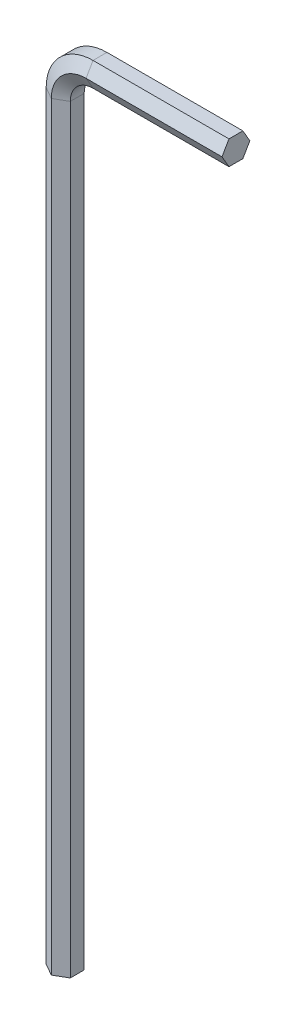
ISO-10303-21;
HEADER;
FILE_DESCRIPTION(('STEP AP214'),'2;1');
FILE_NAME('part.step','',(''),(''),'','','');
FILE_SCHEMA(('AUTOMOTIVE_DESIGN { 1 0 10303 214 1 1 1 1 }'));
ENDSEC;
DATA;
#1=APPLICATION_CONTEXT('core data for automotive mechanical design processes');
#2=APPLICATION_PROTOCOL_DEFINITION('international standard','automotive_design',2000,#1);
#3=PRODUCT_CONTEXT('',#1,'mechanical');
#4=PRODUCT('Part','Part','',(#3));
#5=PRODUCT_RELATED_PRODUCT_CATEGORY('part','',(#4));
#6=PRODUCT_DEFINITION_FORMATION('','',#4);
#7=PRODUCT_DEFINITION_CONTEXT('part definition',#1,'design');
#8=PRODUCT_DEFINITION('design','',#6,#7);
#9=PRODUCT_DEFINITION_SHAPE('','',#8);
#10=(LENGTH_UNIT() NAMED_UNIT(*) SI_UNIT(.MILLI.,.METRE.));
#11=(NAMED_UNIT(*) PLANE_ANGLE_UNIT() SI_UNIT($,.RADIAN.));
#12=(NAMED_UNIT(*) SI_UNIT($,.STERADIAN.) SOLID_ANGLE_UNIT());
#13=UNCERTAINTY_MEASURE_WITH_UNIT(LENGTH_MEASURE(1.E-05),#10,'distance_accuracy_value','');
#14=(GEOMETRIC_REPRESENTATION_CONTEXT(3) GLOBAL_UNCERTAINTY_ASSIGNED_CONTEXT((#13)) GLOBAL_UNIT_ASSIGNED_CONTEXT((#10,
#11,#12)) REPRESENTATION_CONTEXT('',''));
#15=CARTESIAN_POINT('',(0.,0.,0.));
#16=DIRECTION('',(0.,0.,1.));
#17=DIRECTION('',(1.,0.,0.));
#18=AXIS2_PLACEMENT_3D('',#15,#16,#17);
#19=CARTESIAN_POINT('',(4.00000000000003,91.2157,-1.5984519552784));
#20=DIRECTION('',(0.,0.500000000000001,-0.866025403784438));
#21=DIRECTION('',(0.,0.866025403784438,0.500000000000001));
#22=AXIS2_PLACEMENT_3D('',#19,#20,#21);
#23=PLANE('',#22);
#24=DIRECTION('',(0.,0.866025403784438,0.500000000000001));
#25=VECTOR('',#24,1.);
#26=CARTESIAN_POINT('',(4.00000000000003,91.2157,-1.5984519552784));
#27=LINE('',#26,#25);
#28=CARTESIAN_POINT('',(4.00000000000003,91.2157,-1.5984519552784));
#29=VERTEX_POINT('',#28);
#30=CARTESIAN_POINT('',(4.00000000000005,92.6,-0.799225977639195));
#31=VERTEX_POINT('',#30);
#32=EDGE_CURVE('E130',#29,#31,#27,.T.);
#33=ORIENTED_EDGE('',*,*,#32,.T.);
#34=DIRECTION('',(1.,0.,0.));
#35=VECTOR('',#34,1.);
#36=CARTESIAN_POINT('',(4.00000000000005,92.6,-0.799225977639195));
#37=LINE('',#36,#35);
#38=CARTESIAN_POINT('',(19.6157,92.6,-0.799225977639195));
#39=VERTEX_POINT('',#38);
#40=EDGE_CURVE('E39',#31,#39,#37,.T.);
#41=ORIENTED_EDGE('',*,*,#40,.T.);
#42=DIRECTION('',(0.,0.866025403784438,0.500000000000001));
#43=VECTOR('',#42,1.);
#44=CARTESIAN_POINT('',(19.6157,91.2157,-1.5984519552784));
#45=LINE('',#44,#43);
#46=CARTESIAN_POINT('',(19.6157,91.2157,-1.5984519552784));
#47=VERTEX_POINT('',#46);
#48=EDGE_CURVE('E46',#47,#39,#45,.T.);
#49=ORIENTED_EDGE('',*,*,#48,.F.);
#50=DIRECTION('',(1.,0.,0.));
#51=VECTOR('',#50,1.);
#52=CARTESIAN_POINT('',(4.00000000000003,91.2157,-1.5984519552784));
#53=LINE('',#52,#51);
#54=EDGE_CURVE('E11',#29,#47,#53,.T.);
#55=ORIENTED_EDGE('',*,*,#54,.F.);
#56=EDGE_LOOP('',(#33,#41,#49,#55));
#57=FACE_BOUND('',#56,.T.);
#58=ADVANCED_FACE('F32',(#57),#23,.T.);
#59=CARTESIAN_POINT('',(4.00000000000005,92.6,-0.799225977639195));
#60=DIRECTION('',(0.,1.,0.));
#61=DIRECTION('',(0.,0.,1.));
#62=AXIS2_PLACEMENT_3D('',#59,#60,#61);
#63=PLANE('',#62);
#64=DIRECTION('',(0.,0.,1.));
#65=VECTOR('',#64,1.);
#66=CARTESIAN_POINT('',(4.00000000000005,92.6,-0.799225977639195));
#67=LINE('',#66,#65);
#68=CARTESIAN_POINT('',(4.00000000000005,92.6,0.799225977639204));
#69=VERTEX_POINT('',#68);
#70=EDGE_CURVE('E177',#31,#69,#67,.T.);
#71=ORIENTED_EDGE('',*,*,#70,.T.);
#72=DIRECTION('',(1.,0.,0.));
#73=VECTOR('',#72,1.);
#74=CARTESIAN_POINT('',(4.00000000000005,92.6,0.799225977639204));
#75=LINE('',#74,#73);
#76=CARTESIAN_POINT('',(19.6157,92.6,0.799225977639204));
#77=VERTEX_POINT('',#76);
#78=EDGE_CURVE('E213',#69,#77,#75,.T.);
#79=ORIENTED_EDGE('',*,*,#78,.T.);
#80=DIRECTION('',(0.,0.,1.));
#81=VECTOR('',#80,1.);
#82=CARTESIAN_POINT('',(19.6157,92.6,-0.799225977639195));
#83=LINE('',#82,#81);
#84=EDGE_CURVE('E54',#39,#77,#83,.T.);
#85=ORIENTED_EDGE('',*,*,#84,.F.);
#86=ORIENTED_EDGE('',*,*,#40,.F.);
#87=EDGE_LOOP('',(#71,#79,#85,#86));
#88=FACE_BOUND('',#87,.T.);
#89=ADVANCED_FACE('F215',(#88),#63,.T.);
#90=CARTESIAN_POINT('',(4.00000000000005,92.6,0.799225977639204));
#91=DIRECTION('',(0.,0.499999999999995,0.866025403784441));
#92=DIRECTION('',(0.,-0.866025403784441,0.499999999999995));
#93=AXIS2_PLACEMENT_3D('',#90,#91,#92);
#94=PLANE('',#93);
#95=DIRECTION('',(0.,-0.866025403784441,0.499999999999995));
#96=VECTOR('',#95,1.);
#97=CARTESIAN_POINT('',(4.00000000000005,92.6,0.799225977639204));
#98=LINE('',#97,#96);
#99=CARTESIAN_POINT('',(4.00000000000003,91.2157,1.5984519552784));
#100=VERTEX_POINT('',#99);
#101=EDGE_CURVE('E174',#69,#100,#98,.T.);
#102=ORIENTED_EDGE('',*,*,#101,.T.);
#103=DIRECTION('',(1.,0.,0.));
#104=VECTOR('',#103,1.);
#105=CARTESIAN_POINT('',(4.00000000000003,91.2157,1.5984519552784));
#106=LINE('',#105,#104);
#107=CARTESIAN_POINT('',(19.6157,91.2157,1.5984519552784));
#108=VERTEX_POINT('',#107);
#109=EDGE_CURVE('E210',#100,#108,#106,.T.);
#110=ORIENTED_EDGE('',*,*,#109,.T.);
#111=DIRECTION('',(0.,-0.866025403784441,0.499999999999995));
#112=VECTOR('',#111,1.);
#113=CARTESIAN_POINT('',(19.6157,92.6,0.799225977639204));
#114=LINE('',#113,#112);
#115=EDGE_CURVE('E199',#77,#108,#114,.T.);
#116=ORIENTED_EDGE('',*,*,#115,.F.);
#117=ORIENTED_EDGE('',*,*,#78,.F.);
#118=EDGE_LOOP('',(#102,#110,#116,#117));
#119=FACE_BOUND('',#118,.T.);
#120=ADVANCED_FACE('F280',(#119),#94,.T.);
#121=CARTESIAN_POINT('',(4.00000000000003,91.2157,1.5984519552784));
#122=DIRECTION('',(0.,-0.500000000000007,0.866025403784435));
#123=DIRECTION('',(0.,-0.866025403784435,-0.500000000000007));
#124=AXIS2_PLACEMENT_3D('',#121,#122,#123);
#125=PLANE('',#124);
#126=DIRECTION('',(0.,-0.866025403784435,-0.500000000000007));
#127=VECTOR('',#126,1.);
#128=CARTESIAN_POINT('',(4.00000000000003,91.2157,1.5984519552784));
#129=LINE('',#128,#127);
#130=CARTESIAN_POINT('',(4.00000000000002,89.8314,0.799225977639185));
#131=VERTEX_POINT('',#130);
#132=EDGE_CURVE('E171',#100,#131,#129,.T.);
#133=ORIENTED_EDGE('',*,*,#132,.T.);
#134=DIRECTION('',(1.,0.,0.));
#135=VECTOR('',#134,1.);
#136=CARTESIAN_POINT('',(4.00000000000002,89.8314,0.799225977639185));
#137=LINE('',#136,#135);
#138=CARTESIAN_POINT('',(19.6157,89.8314,0.799225977639185));
#139=VERTEX_POINT('',#138);
#140=EDGE_CURVE('E207',#131,#139,#137,.T.);
#141=ORIENTED_EDGE('',*,*,#140,.T.);
#142=DIRECTION('',(0.,-0.866025403784435,-0.500000000000007));
#143=VECTOR('',#142,1.);
#144=CARTESIAN_POINT('',(19.6157,91.2157,1.5984519552784));
#145=LINE('',#144,#143);
#146=EDGE_CURVE('E196',#108,#139,#145,.T.);
#147=ORIENTED_EDGE('',*,*,#146,.F.);
#148=ORIENTED_EDGE('',*,*,#109,.F.);
#149=EDGE_LOOP('',(#133,#141,#147,#148));
#150=FACE_BOUND('',#149,.T.);
#151=ADVANCED_FACE('F279',(#150),#125,.T.);
#152=CARTESIAN_POINT('',(4.00000000000002,89.8314,0.799225977639185));
#153=DIRECTION('',(0.,-1.,0.));
#154=DIRECTION('',(0.,0.,-1.));
#155=AXIS2_PLACEMENT_3D('',#152,#153,#154);
#156=PLANE('',#155);
#157=DIRECTION('',(0.,0.,-1.));
#158=VECTOR('',#157,1.);
#159=CARTESIAN_POINT('',(4.00000000000002,89.8314,0.799225977639185));
#160=LINE('',#159,#158);
#161=CARTESIAN_POINT('',(4.00000000000002,89.8314,-0.799225977639214));
#162=VERTEX_POINT('',#161);
#163=EDGE_CURVE('E163',#131,#162,#160,.T.);
#164=ORIENTED_EDGE('',*,*,#163,.T.);
#165=DIRECTION('',(1.,0.,0.));
#166=VECTOR('',#165,1.);
#167=CARTESIAN_POINT('',(4.00000000000002,89.8314,-0.799225977639214));
#168=LINE('',#167,#166);
#169=CARTESIAN_POINT('',(19.6157,89.8314,-0.799225977639214));
#170=VERTEX_POINT('',#169);
#171=EDGE_CURVE('E204',#162,#170,#168,.T.);
#172=ORIENTED_EDGE('',*,*,#171,.T.);
#173=DIRECTION('',(0.,0.,-1.));
#174=VECTOR('',#173,1.);
#175=CARTESIAN_POINT('',(19.6157,89.8314,0.799225977639185));
#176=LINE('',#175,#174);
#177=EDGE_CURVE('E193',#139,#170,#176,.T.);
#178=ORIENTED_EDGE('',*,*,#177,.F.);
#179=ORIENTED_EDGE('',*,*,#140,.F.);
#180=EDGE_LOOP('',(#164,#172,#178,#179));
#181=FACE_BOUND('',#180,.T.);
#182=ADVANCED_FACE('F286',(#181),#156,.T.);
#183=CARTESIAN_POINT('',(4.00000000000002,89.8314,-0.799225977639214));
#184=DIRECTION('',(0.,-0.499999999999995,-0.866025403784442));
#185=DIRECTION('',(0.,0.866025403784441,-0.499999999999995));
#186=AXIS2_PLACEMENT_3D('',#183,#184,#185);
#187=PLANE('',#186);
#188=DIRECTION('',(0.,0.866025403784442,-0.499999999999995));
#189=VECTOR('',#188,1.);
#190=CARTESIAN_POINT('',(4.00000000000002,89.8314,-0.799225977639214));
#191=LINE('',#190,#189);
#192=EDGE_CURVE('E160',#162,#29,#191,.T.);
#193=ORIENTED_EDGE('',*,*,#192,.T.);
#194=ORIENTED_EDGE('',*,*,#54,.T.);
#195=DIRECTION('',(0.,0.866025403784442,-0.499999999999995));
#196=VECTOR('',#195,1.);
#197=CARTESIAN_POINT('',(19.6157,89.8314,-0.799225977639214));
#198=LINE('',#197,#196);
#199=EDGE_CURVE('E133',#170,#47,#198,.T.);
#200=ORIENTED_EDGE('',*,*,#199,.F.);
#201=ORIENTED_EDGE('',*,*,#171,.F.);
#202=EDGE_LOOP('',(#193,#194,#200,#201));
#203=FACE_BOUND('',#202,.T.);
#204=ADVANCED_FACE('F284',(#203),#187,.T.);
#205=CARTESIAN_POINT('',(4.,87.2157,-1.5984519552784));
#206=DIRECTION('',(0.,0.,1.));
#207=DIRECTION('',(1.,0.,0.));
#208=AXIS2_PLACEMENT_3D('',#205,#206,#207);
#209=CONICAL_SURFACE('',#208,4.,1.0471975511966);
#210=DIRECTION('',(-0.866025403784438,0.,0.500000000000001));
#211=VECTOR('',#210,1.);
#212=CARTESIAN_POINT('',(0.,87.2157,-1.5984519552784));
#213=LINE('',#212,#211);
#214=CARTESIAN_POINT('',(0.,87.2157,-1.5984519552784));
#215=VERTEX_POINT('',#214);
#216=CARTESIAN_POINT('',(-1.3843,87.2157,-0.799225977639195));
#217=VERTEX_POINT('',#216);
#218=EDGE_CURVE('E127',#215,#217,#213,.T.);
#219=ORIENTED_EDGE('',*,*,#218,.T.);
#220=CARTESIAN_POINT('',(4.,87.2157,-0.799225977639195));
#221=DIRECTION('',(0.,0.,-1.));
#222=DIRECTION('',(-1.,0.,0.));
#223=AXIS2_PLACEMENT_3D('',#220,#221,#222);
#224=CIRCLE('',#223,5.3843);
#225=EDGE_CURVE('E134',#217,#31,#224,.T.);
#226=ORIENTED_EDGE('',*,*,#225,.T.);
#227=ORIENTED_EDGE('',*,*,#32,.F.);
#228=CARTESIAN_POINT('',(4.,87.2157,-1.5984519552784));
#229=DIRECTION('',(0.,0.,-1.));
#230=DIRECTION('',(-1.,0.,0.));
#231=AXIS2_PLACEMENT_3D('',#228,#229,#230);
#232=CIRCLE('',#231,4.);
#233=EDGE_CURVE('E122',#215,#29,#232,.T.);
#234=ORIENTED_EDGE('',*,*,#233,.F.);
#235=EDGE_LOOP('',(#219,#226,#227,#234));
#236=FACE_BOUND('',#235,.T.);
#237=ADVANCED_FACE('F124',(#236),#209,.T.);
#238=CARTESIAN_POINT('',(4.,87.2157,0.));
#239=DIRECTION('',(0.,0.,-1.));
#240=DIRECTION('',(-1.,0.,0.));
#241=AXIS2_PLACEMENT_3D('',#238,#239,#240);
#242=CYLINDRICAL_SURFACE('',#241,5.3843);
#243=DIRECTION('',(0.,0.,1.));
#244=VECTOR('',#243,1.);
#245=CARTESIAN_POINT('',(-1.3843,87.2157,-0.799225977639195));
#246=LINE('',#245,#244);
#247=CARTESIAN_POINT('',(-1.38429999999999,87.2157,0.799225977639204));
#248=VERTEX_POINT('',#247);
#249=EDGE_CURVE('E155',#217,#248,#246,.T.);
#250=ORIENTED_EDGE('',*,*,#249,.T.);
#251=CARTESIAN_POINT('',(4.,87.2157,0.799225977639204));
#252=DIRECTION('',(0.,0.,-1.));
#253=DIRECTION('',(-1.,0.,0.));
#254=AXIS2_PLACEMENT_3D('',#251,#252,#253);
#255=CIRCLE('',#254,5.38429999999999);
#256=EDGE_CURVE('E188',#248,#69,#255,.T.);
#257=ORIENTED_EDGE('',*,*,#256,.T.);
#258=ORIENTED_EDGE('',*,*,#70,.F.);
#259=ORIENTED_EDGE('',*,*,#225,.F.);
#260=EDGE_LOOP('',(#250,#257,#258,#259));
#261=FACE_BOUND('',#260,.T.);
#262=ADVANCED_FACE('F224',(#261),#242,.T.);
#263=CARTESIAN_POINT('',(4.,87.2157,0.799225977639204));
#264=DIRECTION('',(0.,0.,-1.));
#265=DIRECTION('',(-1.,0.,0.));
#266=AXIS2_PLACEMENT_3D('',#263,#264,#265);
#267=CONICAL_SURFACE('',#266,5.38429999999999,1.0471975511966);
#268=DIRECTION('',(0.866025403784441,0.,0.499999999999995));
#269=VECTOR('',#268,1.);
#270=CARTESIAN_POINT('',(-1.38429999999999,87.2157,0.799225977639204));
#271=LINE('',#270,#269);
#272=CARTESIAN_POINT('',(0.,87.2157,1.5984519552784));
#273=VERTEX_POINT('',#272);
#274=EDGE_CURVE('E227',#248,#273,#271,.T.);
#275=ORIENTED_EDGE('',*,*,#274,.T.);
#276=CARTESIAN_POINT('',(4.,87.2157,1.5984519552784));
#277=DIRECTION('',(0.,0.,-1.));
#278=DIRECTION('',(-1.,0.,0.));
#279=AXIS2_PLACEMENT_3D('',#276,#277,#278);
#280=CIRCLE('',#279,3.99999999999999);
#281=EDGE_CURVE('E185',#273,#100,#280,.T.);
#282=ORIENTED_EDGE('',*,*,#281,.T.);
#283=ORIENTED_EDGE('',*,*,#101,.F.);
#284=ORIENTED_EDGE('',*,*,#256,.F.);
#285=EDGE_LOOP('',(#275,#282,#283,#284));
#286=FACE_BOUND('',#285,.T.);
#287=ADVANCED_FACE('F220',(#286),#267,.T.);
#288=CARTESIAN_POINT('',(4.,87.2157,1.5984519552784));
#289=DIRECTION('',(0.,0.,1.));
#290=DIRECTION('',(1.,0.,0.));
#291=AXIS2_PLACEMENT_3D('',#288,#289,#290);
#292=CONICAL_SURFACE('',#291,3.99999999999999,1.04719755119659);
#293=DIRECTION('',(0.866025403784435,0.,-0.500000000000007));
#294=VECTOR('',#293,1.);
#295=CARTESIAN_POINT('',(0.,87.2157,1.5984519552784));
#296=LINE('',#295,#294);
#297=CARTESIAN_POINT('',(1.38430000000001,87.2157,0.799225977639185));
#298=VERTEX_POINT('',#297);
#299=EDGE_CURVE('E241',#273,#298,#296,.T.);
#300=ORIENTED_EDGE('',*,*,#299,.T.);
#301=CARTESIAN_POINT('',(4.,87.2157,0.799225977639185));
#302=DIRECTION('',(0.,0.,-1.));
#303=DIRECTION('',(-1.,0.,0.));
#304=AXIS2_PLACEMENT_3D('',#301,#302,#303);
#305=CIRCLE('',#304,2.61569999999999);
#306=EDGE_CURVE('E182',#298,#131,#305,.T.);
#307=ORIENTED_EDGE('',*,*,#306,.T.);
#308=ORIENTED_EDGE('',*,*,#132,.F.);
#309=ORIENTED_EDGE('',*,*,#281,.F.);
#310=EDGE_LOOP('',(#300,#307,#308,#309));
#311=FACE_BOUND('',#310,.T.);
#312=ADVANCED_FACE('F277',(#311),#292,.F.);
#313=CARTESIAN_POINT('',(4.,87.2157,0.));
#314=DIRECTION('',(0.,0.,-1.));
#315=DIRECTION('',(-1.,0.,0.));
#316=AXIS2_PLACEMENT_3D('',#313,#314,#315);
#317=CYLINDRICAL_SURFACE('',#316,2.6157);
#318=DIRECTION('',(0.,0.,-1.));
#319=VECTOR('',#318,1.);
#320=CARTESIAN_POINT('',(1.38430000000001,87.2157,0.799225977639185));
#321=LINE('',#320,#319);
#322=CARTESIAN_POINT('',(1.38429999999999,87.2157,-0.799225977639214));
#323=VERTEX_POINT('',#322);
#324=EDGE_CURVE('E244',#298,#323,#321,.T.);
#325=ORIENTED_EDGE('',*,*,#324,.T.);
#326=CARTESIAN_POINT('',(4.,87.2157,-0.799225977639214));
#327=DIRECTION('',(0.,0.,-1.));
#328=DIRECTION('',(-1.,0.,0.));
#329=AXIS2_PLACEMENT_3D('',#326,#327,#328);
#330=CIRCLE('',#329,2.61570000000001);
#331=EDGE_CURVE('E140',#323,#162,#330,.T.);
#332=ORIENTED_EDGE('',*,*,#331,.T.);
#333=ORIENTED_EDGE('',*,*,#163,.F.);
#334=ORIENTED_EDGE('',*,*,#306,.F.);
#335=EDGE_LOOP('',(#325,#332,#333,#334));
#336=FACE_BOUND('',#335,.T.);
#337=ADVANCED_FACE('F274',(#336),#317,.F.);
#338=CARTESIAN_POINT('',(4.,87.2157,-0.799225977639214));
#339=DIRECTION('',(0.,0.,-1.));
#340=DIRECTION('',(-1.,0.,0.));
#341=AXIS2_PLACEMENT_3D('',#338,#339,#340);
#342=CONICAL_SURFACE('',#341,2.61570000000001,1.0471975511966);
#343=DIRECTION('',(-0.866025403784442,0.,-0.499999999999995));
#344=VECTOR('',#343,1.);
#345=CARTESIAN_POINT('',(1.38429999999999,87.2157,-0.799225977639214));
#346=LINE('',#345,#344);
#347=EDGE_CURVE('E137',#323,#215,#346,.T.);
#348=ORIENTED_EDGE('',*,*,#347,.T.);
#349=ORIENTED_EDGE('',*,*,#233,.T.);
#350=ORIENTED_EDGE('',*,*,#192,.F.);
#351=ORIENTED_EDGE('',*,*,#331,.F.);
#352=EDGE_LOOP('',(#348,#349,#350,#351));
#353=FACE_BOUND('',#352,.T.);
#354=ADVANCED_FACE('F138',(#353),#342,.F.);
#355=CARTESIAN_POINT('',(1.38429999999999,87.2157,-0.799225977639214));
#356=DIRECTION('',(-0.499999999999995,0.,0.866025403784442));
#357=DIRECTION('',(0.866025403784442,0.,0.499999999999995));
#358=AXIS2_PLACEMENT_3D('',#355,#356,#357);
#359=PLANE('',#358);
#360=DIRECTION('',(-0.866025403784442,0.,-0.499999999999995));
#361=VECTOR('',#360,1.);
#362=CARTESIAN_POINT('',(1.38429999999999,0.,-0.799225977639214));
#363=LINE('',#362,#361);
#364=CARTESIAN_POINT('',(1.38429999999999,0.,-0.799225977639214));
#365=VERTEX_POINT('',#364);
#366=CARTESIAN_POINT('',(0.,0.,-1.5984519552784));
#367=VERTEX_POINT('',#366);
#368=EDGE_CURVE('E159',#365,#367,#363,.T.);
#369=ORIENTED_EDGE('',*,*,#368,.T.);
#370=DIRECTION('',(0.,-1.,0.));
#371=VECTOR('',#370,1.);
#372=CARTESIAN_POINT('',(0.,87.2157,-1.5984519552784));
#373=LINE('',#372,#371);
#374=EDGE_CURVE('E150',#215,#367,#373,.T.);
#375=ORIENTED_EDGE('',*,*,#374,.F.);
#376=ORIENTED_EDGE('',*,*,#347,.F.);
#377=DIRECTION('',(0.,-1.,0.));
#378=VECTOR('',#377,1.);
#379=CARTESIAN_POINT('',(1.38429999999999,87.2157,-0.799225977639214));
#380=LINE('',#379,#378);
#381=EDGE_CURVE('E248',#323,#365,#380,.T.);
#382=ORIENTED_EDGE('',*,*,#381,.T.);
#383=EDGE_LOOP('',(#369,#375,#376,#382));
#384=FACE_BOUND('',#383,.T.);
#385=ADVANCED_FACE('F157',(#384),#359,.F.);
#386=CARTESIAN_POINT('',(0.,87.2157,-1.5984519552784));
#387=DIRECTION('',(0.500000000000001,0.,0.866025403784438));
#388=DIRECTION('',(0.866025403784438,0.,-0.500000000000001));
#389=AXIS2_PLACEMENT_3D('',#386,#387,#388);
#390=PLANE('',#389);
#391=DIRECTION('',(-0.866025403784438,0.,0.500000000000001));
#392=VECTOR('',#391,1.);
#393=CARTESIAN_POINT('',(0.,0.,-1.5984519552784));
#394=LINE('',#393,#392);
#395=CARTESIAN_POINT('',(-1.3843,0.,-0.799225977639195));
#396=VERTEX_POINT('',#395);
#397=EDGE_CURVE('E250',#367,#396,#394,.T.);
#398=ORIENTED_EDGE('',*,*,#397,.T.);
#399=DIRECTION('',(0.,-1.,0.));
#400=VECTOR('',#399,1.);
#401=CARTESIAN_POINT('',(-1.3843,87.2157,-0.799225977639195));
#402=LINE('',#401,#400);
#403=EDGE_CURVE('E153',#217,#396,#402,.T.);
#404=ORIENTED_EDGE('',*,*,#403,.F.);
#405=ORIENTED_EDGE('',*,*,#218,.F.);
#406=ORIENTED_EDGE('',*,*,#374,.T.);
#407=EDGE_LOOP('',(#398,#404,#405,#406));
#408=FACE_BOUND('',#407,.T.);
#409=ADVANCED_FACE('F149',(#408),#390,.F.);
#410=CARTESIAN_POINT('',(-1.3843,87.2157,-0.799225977639195));
#411=DIRECTION('',(1.,0.,0.));
#412=DIRECTION('',(0.,0.,-1.));
#413=AXIS2_PLACEMENT_3D('',#410,#411,#412);
#414=PLANE('',#413);
#415=DIRECTION('',(0.,0.,1.));
#416=VECTOR('',#415,1.);
#417=CARTESIAN_POINT('',(-1.3843,0.,-0.799225977639195));
#418=LINE('',#417,#416);
#419=CARTESIAN_POINT('',(-1.38429999999999,0.,0.799225977639204));
#420=VERTEX_POINT('',#419);
#421=EDGE_CURVE('E233',#396,#420,#418,.T.);
#422=ORIENTED_EDGE('',*,*,#421,.T.);
#423=DIRECTION('',(0.,-1.,0.));
#424=VECTOR('',#423,1.);
#425=CARTESIAN_POINT('',(-1.38429999999999,87.2157,0.799225977639204));
#426=LINE('',#425,#424);
#427=EDGE_CURVE('E165',#248,#420,#426,.T.);
#428=ORIENTED_EDGE('',*,*,#427,.F.);
#429=ORIENTED_EDGE('',*,*,#249,.F.);
#430=ORIENTED_EDGE('',*,*,#403,.T.);
#431=EDGE_LOOP('',(#422,#428,#429,#430));
#432=FACE_BOUND('',#431,.T.);
#433=ADVANCED_FACE('F231',(#432),#414,.F.);
#434=CARTESIAN_POINT('',(-1.38429999999999,87.2157,0.799225977639204));
#435=DIRECTION('',(0.499999999999995,0.,-0.866025403784441));
#436=DIRECTION('',(-0.866025403784441,0.,-0.499999999999995));
#437=AXIS2_PLACEMENT_3D('',#434,#435,#436);
#438=PLANE('',#437);
#439=DIRECTION('',(0.866025403784441,0.,0.499999999999995));
#440=VECTOR('',#439,1.);
#441=CARTESIAN_POINT('',(-1.38429999999999,0.,0.799225977639204));
#442=LINE('',#441,#440);
#443=CARTESIAN_POINT('',(0.,0.,1.5984519552784));
#444=VERTEX_POINT('',#443);
#445=EDGE_CURVE('E253',#420,#444,#442,.T.);
#446=ORIENTED_EDGE('',*,*,#445,.T.);
#447=DIRECTION('',(0.,-1.,0.));
#448=VECTOR('',#447,1.);
#449=CARTESIAN_POINT('',(0.,87.2157,1.5984519552784));
#450=LINE('',#449,#448);
#451=EDGE_CURVE('E236',#273,#444,#450,.T.);
#452=ORIENTED_EDGE('',*,*,#451,.F.);
#453=ORIENTED_EDGE('',*,*,#274,.F.);
#454=ORIENTED_EDGE('',*,*,#427,.T.);
#455=EDGE_LOOP('',(#446,#452,#453,#454));
#456=FACE_BOUND('',#455,.T.);
#457=ADVANCED_FACE('F238',(#456),#438,.F.);
#458=CARTESIAN_POINT('',(0.,87.2157,1.5984519552784));
#459=DIRECTION('',(-0.500000000000007,0.,-0.866025403784435));
#460=DIRECTION('',(-0.866025403784435,0.,0.500000000000007));
#461=AXIS2_PLACEMENT_3D('',#458,#459,#460);
#462=PLANE('',#461);
#463=DIRECTION('',(0.866025403784435,0.,-0.500000000000007));
#464=VECTOR('',#463,1.);
#465=CARTESIAN_POINT('',(0.,0.,1.5984519552784));
#466=LINE('',#465,#464);
#467=CARTESIAN_POINT('',(1.38430000000001,0.,0.799225977639185));
#468=VERTEX_POINT('',#467);
#469=EDGE_CURVE('E255',#444,#468,#466,.T.);
#470=ORIENTED_EDGE('',*,*,#469,.T.);
#471=DIRECTION('',(0.,-1.,0.));
#472=VECTOR('',#471,1.);
#473=CARTESIAN_POINT('',(1.38430000000001,87.2157,0.799225977639185));
#474=LINE('',#473,#472);
#475=EDGE_CURVE('E259',#298,#468,#474,.T.);
#476=ORIENTED_EDGE('',*,*,#475,.F.);
#477=ORIENTED_EDGE('',*,*,#299,.F.);
#478=ORIENTED_EDGE('',*,*,#451,.T.);
#479=EDGE_LOOP('',(#470,#476,#477,#478));
#480=FACE_BOUND('',#479,.T.);
#481=ADVANCED_FACE('F264',(#480),#462,.F.);
#482=CARTESIAN_POINT('',(1.38430000000001,87.2157,0.799225977639185));
#483=DIRECTION('',(-1.,0.,0.));
#484=DIRECTION('',(0.,0.,1.));
#485=AXIS2_PLACEMENT_3D('',#482,#483,#484);
#486=PLANE('',#485);
#487=DIRECTION('',(0.,0.,-1.));
#488=VECTOR('',#487,1.);
#489=CARTESIAN_POINT('',(1.38430000000001,0.,0.799225977639185));
#490=LINE('',#489,#488);
#491=EDGE_CURVE('E145',#468,#365,#490,.T.);
#492=ORIENTED_EDGE('',*,*,#491,.T.);
#493=ORIENTED_EDGE('',*,*,#381,.F.);
#494=ORIENTED_EDGE('',*,*,#324,.F.);
#495=ORIENTED_EDGE('',*,*,#475,.T.);
#496=EDGE_LOOP('',(#492,#493,#494,#495));
#497=FACE_BOUND('',#496,.T.);
#498=ADVANCED_FACE('F271',(#497),#486,.F.);
#499=CARTESIAN_POINT('',(19.6157,91.2157,0.));
#500=DIRECTION('',(1.,0.,0.));
#501=DIRECTION('',(0.,0.,1.));
#502=AXIS2_PLACEMENT_3D('',#499,#500,#501);
#503=PLANE('',#502);
#504=ORIENTED_EDGE('',*,*,#199,.T.);
#505=ORIENTED_EDGE('',*,*,#48,.T.);
#506=ORIENTED_EDGE('',*,*,#84,.T.);
#507=ORIENTED_EDGE('',*,*,#115,.T.);
#508=ORIENTED_EDGE('',*,*,#146,.T.);
#509=ORIENTED_EDGE('',*,*,#177,.T.);
#510=EDGE_LOOP('',(#504,#505,#506,#507,#508,#509));
#511=FACE_BOUND('',#510,.T.);
#512=ADVANCED_FACE('F282',(#511),#503,.T.);
#513=CARTESIAN_POINT('',(0.,0.,0.));
#514=DIRECTION('',(0.,1.,0.));
#515=DIRECTION('',(0.,0.,1.));
#516=AXIS2_PLACEMENT_3D('',#513,#514,#515);
#517=PLANE('',#516);
#518=ORIENTED_EDGE('',*,*,#368,.F.);
#519=ORIENTED_EDGE('',*,*,#491,.F.);
#520=ORIENTED_EDGE('',*,*,#469,.F.);
#521=ORIENTED_EDGE('',*,*,#445,.F.);
#522=ORIENTED_EDGE('',*,*,#421,.F.);
#523=ORIENTED_EDGE('',*,*,#397,.F.);
#524=EDGE_LOOP('',(#518,#519,#520,#521,#522,#523));
#525=FACE_BOUND('',#524,.T.);
#526=ADVANCED_FACE('F268',(#525),#517,.F.);
#527=CLOSED_SHELL('',(#58,#89,#120,#151,#182,#204,#237,#262,#287,#312,#337,#354,#385,#409,#433,
#457,#481,#498,#512,#526));
#528=MANIFOLD_SOLID_BREP('B2',#527);
#529=ADVANCED_BREP_SHAPE_REPRESENTATION('',(#18,#528),#14);
#530=SHAPE_DEFINITION_REPRESENTATION(#9,#529);
ENDSEC;
END-ISO-10303-21;
